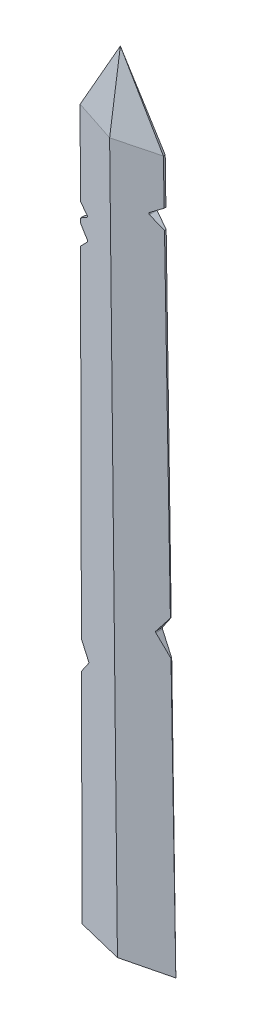
ISO-10303-21;
HEADER;
FILE_DESCRIPTION(('STEP AP214'),'2;1');
FILE_NAME('part.step','',(''),(''),'','','');
FILE_SCHEMA(('AUTOMOTIVE_DESIGN { 1 0 10303 214 1 1 1 1 }'));
ENDSEC;
DATA;
#1=APPLICATION_CONTEXT('core data for automotive mechanical design processes');
#2=APPLICATION_PROTOCOL_DEFINITION('international standard','automotive_design',2000,#1);
#3=PRODUCT_CONTEXT('',#1,'mechanical');
#4=PRODUCT('Part','Part','',(#3));
#5=PRODUCT_RELATED_PRODUCT_CATEGORY('part','',(#4));
#6=PRODUCT_DEFINITION_FORMATION('','',#4);
#7=PRODUCT_DEFINITION_CONTEXT('part definition',#1,'design');
#8=PRODUCT_DEFINITION('design','',#6,#7);
#9=PRODUCT_DEFINITION_SHAPE('','',#8);
#10=(LENGTH_UNIT() NAMED_UNIT(*) SI_UNIT(.MILLI.,.METRE.));
#11=(NAMED_UNIT(*) PLANE_ANGLE_UNIT() SI_UNIT($,.RADIAN.));
#12=(NAMED_UNIT(*) SI_UNIT($,.STERADIAN.) SOLID_ANGLE_UNIT());
#13=UNCERTAINTY_MEASURE_WITH_UNIT(LENGTH_MEASURE(1.E-05),#10,'distance_accuracy_value','');
#14=(GEOMETRIC_REPRESENTATION_CONTEXT(3) GLOBAL_UNCERTAINTY_ASSIGNED_CONTEXT((#13)) GLOBAL_UNIT_ASSIGNED_CONTEXT((#10,
#11,#12)) REPRESENTATION_CONTEXT('',''));
#15=CARTESIAN_POINT('',(0.,0.,0.));
#16=DIRECTION('',(0.,0.,1.));
#17=DIRECTION('',(1.,0.,0.));
#18=AXIS2_PLACEMENT_3D('',#15,#16,#17);
#19=CARTESIAN_POINT('',(134.681996719391,219.836565958458,-9.525));
#20=DIRECTION('',(0.999866416510167,0.0163446974617832,0.));
#21=DIRECTION('',(-0.0163446974617832,0.999866416510167,0.));
#22=AXIS2_PLACEMENT_3D('',#19,#20,#21);
#23=PLANE('',#22);
#24=DIRECTION('',(0.,0.,1.));
#25=VECTOR('',#24,1.);
#26=CARTESIAN_POINT('',(130.972260191043,446.775056405867,-9.52500000000005));
#27=LINE('',#26,#25);
#28=CARTESIAN_POINT('',(130.972260191043,446.775056405867,-0.295268139187183));
#29=VERTEX_POINT('',#28);
#30=CARTESIAN_POINT('',(130.972260191043,446.775056405867,0.29526813918717));
#31=VERTEX_POINT('',#30);
#32=EDGE_CURVE('E408',#29,#31,#27,.T.);
#33=ORIENTED_EDGE('',*,*,#32,.T.);
#34=DIRECTION('',(-0.0163446836309879,0.999865570428571,0.00130091834944232));
#35=VECTOR('',#34,1.);
#36=CARTESIAN_POINT('',(134.682199250408,219.824176376929,-1.61200009608092E-05));
#37=LINE('',#36,#35);
#38=CARTESIAN_POINT('',(134.681996719391,219.836565958458,0.));
#39=VERTEX_POINT('',#38);
#40=EDGE_CURVE('E353',#39,#31,#37,.T.);
#41=ORIENTED_EDGE('',*,*,#40,.F.);
#42=DIRECTION('',(0.0163446836309879,-0.999865570428571,0.00130091834944232));
#43=VECTOR('',#42,1.);
#44=CARTESIAN_POINT('',(134.681794188375,219.848955539986,-1.61200009590745E-05));
#45=LINE('',#44,#43);
#46=EDGE_CURVE('E315',#29,#39,#45,.T.);
#47=ORIENTED_EDGE('',*,*,#46,.F.);
#48=EDGE_LOOP('',(#33,#41,#47));
#49=FACE_BOUND('',#48,.T.);
#50=ADVANCED_FACE('F33',(#49),#23,.T.);
#51=CARTESIAN_POINT('',(49.2246430956603,942.792954579603,0.));
#52=DIRECTION('',(0.238804060374286,0.00264025652948276,0.971064184178478));
#53=DIRECTION('',(0.971067568818316,0.,-0.238804892724763));
#54=AXIS2_PLACEMENT_3D('',#51,#52,#53);
#55=PLANE('',#54);
#56=DIRECTION('',(0.565422398289262,-0.813371444013876,-0.136837149837325));
#57=VECTOR('',#56,1.);
#58=CARTESIAN_POINT('',(-183.97331902332,770.956796433762,57.8152429862953));
#59=LINE('',#58,#57);
#60=CARTESIAN_POINT('',(57.2177665065291,423.998589411468,-0.555102457980421));
#61=VERTEX_POINT('',#60);
#62=CARTESIAN_POINT('',(65.1458488288728,412.593884210018,-2.47376749839539));
#63=VERTEX_POINT('',#62);
#64=EDGE_CURVE('E238',#61,#63,#59,.T.);
#65=ORIENTED_EDGE('',*,*,#64,.F.);
#66=DIRECTION('',(0.,0.999996303727557,-0.00271892096670104));
#67=VECTOR('',#66,1.);
#68=CARTESIAN_POINT('',(57.2177665065291,807.125541731836,-1.59679821194385));
#69=LINE('',#68,#67);
#70=CARTESIAN_POINT('',(57.2177665065291,705.432335957503,-1.32030140058543));
#71=VERTEX_POINT('',#70);
#72=EDGE_CURVE('E325',#61,#71,#69,.T.);
#73=ORIENTED_EDGE('',*,*,#72,.T.);
#74=DIRECTION('',(-0.696425219158623,-0.696425219158644,0.173158390613042));
#75=VECTOR('',#74,1.);
#76=CARTESIAN_POINT('',(168.303638707019,816.518208157996,-28.9405689051451));
#77=LINE('',#76,#75);
#78=CARTESIAN_POINT('',(64.8636119693734,713.078181420348,-3.22135589832697));
#79=VERTEX_POINT('',#78);
#80=EDGE_CURVE('E250',#79,#71,#77,.T.);
#81=ORIENTED_EDGE('',*,*,#80,.F.);
#82=CARTESIAN_POINT('',(64.1900927602932,713.751700629428,-3.05755533707624));
#83=DIRECTION('',(0.238804060374286,0.00264025652948276,0.971064184178478));
#84=DIRECTION('',(-0.971004838791762,-0.0107355874174045,0.238818655481073));
#85=AXIS2_PLACEMENT_3D('',#82,#83,#84);
#86=ELLIPSE('',#85,0.980882639396106,0.952500000000012);
#87=CARTESIAN_POINT('',(64.8636119693734,714.425219838508,-3.22501840286267));
#88=VERTEX_POINT('',#87);
#89=EDGE_CURVE('E257',#88,#79,#86,.F.);
#90=ORIENTED_EDGE('',*,*,#89,.F.);
#91=DIRECTION('',(0.696877354228562,-0.696877354228535,-0.169481286066742));
#92=VECTOR('',#91,1.);
#93=CARTESIAN_POINT('',(-54.0162263991512,833.305058207028,25.6866800069781));
#94=LINE('',#93,#92);
#95=CARTESIAN_POINT('',(57.2177665065291,722.071065301352,-1.36554095787541));
#96=VERTEX_POINT('',#95);
#97=EDGE_CURVE('E255',#96,#88,#94,.T.);
#98=ORIENTED_EDGE('',*,*,#97,.F.);
#99=CARTESIAN_POINT('',(57.2177665065291,725.582342683302,-1.37508787885712));
#100=VERTEX_POINT('',#99);
#101=EDGE_CURVE('E455',#96,#100,#69,.T.);
#102=ORIENTED_EDGE('',*,*,#101,.T.);
#103=DIRECTION('',(-0.804607640589238,-0.559330162341017,0.199389854809593));
#104=VECTOR('',#103,1.);
#105=CARTESIAN_POINT('',(149.576215529185,789.786140509004,-24.2624391940651));
#106=LINE('',#105,#104);
#107=CARTESIAN_POINT('',(64.4504287366713,730.610192203076,-3.16741422427782));
#108=VERTEX_POINT('',#107);
#109=EDGE_CURVE('E267',#108,#100,#106,.T.);
#110=ORIENTED_EDGE('',*,*,#109,.F.);
#111=CARTESIAN_POINT('',(63.9067498173311,731.392285217151,-3.03583918590961));
#112=DIRECTION('',(0.238804060374286,0.00264025652948276,0.971064184178478));
#113=DIRECTION('',(-0.971004838791762,-0.0107355874174045,0.238818655481073));
#114=AXIS2_PLACEMENT_3D('',#111,#112,#113);
#115=ELLIPSE('',#114,0.980882639396072,0.952499999999979);
#116=CARTESIAN_POINT('',(64.475710809278,732.156182880221,-3.17783503243639));
#117=VERTEX_POINT('',#116);
#118=EDGE_CURVE('E274',#117,#108,#115,.F.);
#119=ORIENTED_EDGE('',*,*,#118,.F.);
#120=DIRECTION('',(0.787076820241769,-0.58622513202071,-0.19196399043937));
#121=VECTOR('',#120,1.);
#122=CARTESIAN_POINT('',(-42.641006156892,811.938117667513,22.9473815954327));
#123=LINE('',#122,#121);
#124=CARTESIAN_POINT('',(57.2177665065291,737.561994927602,-1.40765972691236));
#125=VERTEX_POINT('',#124);
#126=EDGE_CURVE('E272',#125,#117,#123,.T.);
#127=ORIENTED_EDGE('',*,*,#126,.F.);
#128=CARTESIAN_POINT('',(57.2177665065291,807.103985498089,-1.59673960203131));
#129=VERTEX_POINT('',#128);
#130=EDGE_CURVE('E319',#125,#129,#69,.T.);
#131=ORIENTED_EDGE('',*,*,#130,.T.);
#132=DIRECTION('',(-0.964371981253038,0.117875055876131,0.236837819987201));
#133=VECTOR('',#132,1.);
#134=CARTESIAN_POINT('',(33.9948623465476,809.942517909522,4.10651816773024));
#135=LINE('',#134,#133);
#136=CARTESIAN_POINT('',(89.5005842942128,803.158061078325,-9.52500000000005));
#137=VERTEX_POINT('',#136);
#138=EDGE_CURVE('E296',#137,#129,#135,.T.);
#139=ORIENTED_EDGE('',*,*,#138,.F.);
#140=DIRECTION('',(0.0110554869516549,-0.999938886236685,0.));
#141=VECTOR('',#140,1.);
#142=CARTESIAN_POINT('',(87.9567582020914,942.792954579603,-9.525));
#143=LINE('',#142,#141);
#144=CARTESIAN_POINT('',(95.9498816129603,219.836565958458,-9.525));
#145=VERTEX_POINT('',#144);
#146=EDGE_CURVE('E313',#137,#145,#143,.T.);
#147=ORIENTED_EDGE('',*,*,#146,.T.);
#148=DIRECTION('',(-0.971067568818316,0.,0.238804892724763));
#149=VECTOR('',#148,1.);
#150=CARTESIAN_POINT('',(57.2177665065291,219.836565958458,0.));
#151=LINE('',#150,#149);
#152=CARTESIAN_POINT('',(57.2177665065291,219.836565958458,0.));
#153=VERTEX_POINT('',#152);
#154=EDGE_CURVE('E307',#145,#153,#151,.T.);
#155=ORIENTED_EDGE('',*,*,#154,.T.);
#156=CARTESIAN_POINT('',(57.2177665065291,400.861282195755,-0.492193715750765));
#157=VERTEX_POINT('',#156);
#158=EDGE_CURVE('E321',#153,#157,#69,.T.);
#159=ORIENTED_EDGE('',*,*,#158,.T.);
#160=DIRECTION('',(-0.590805433978455,-0.793226419267353,0.147447573590831));
#161=VECTOR('',#160,1.);
#162=CARTESIAN_POINT('',(308.357084243052,738.045624600859,-63.1691443730078));
#163=LINE('',#162,#161);
#164=CARTESIAN_POINT('',(65.1276534778671,411.481244298731,-2.46626770733161));
#165=VERTEX_POINT('',#164);
#166=EDGE_CURVE('E56',#165,#157,#163,.T.);
#167=ORIENTED_EDGE('',*,*,#166,.F.);
#168=CARTESIAN_POINT('',(64.3637558147976,412.050205290678,-2.27995699417265));
#169=DIRECTION('',(0.238804060374286,0.00264025652948276,0.971064184178478));
#170=DIRECTION('',(-0.971004838791762,-0.0107355874174045,0.238818655481073));
#171=AXIS2_PLACEMENT_3D('',#168,#169,#170);
#172=ELLIPSE('',#171,0.980882639396234,0.952500000000136);
#173=EDGE_CURVE('E240',#63,#165,#172,.F.);
#174=ORIENTED_EDGE('',*,*,#173,.F.);
#175=EDGE_LOOP('',(#65,#73,#81,#90,#98,#102,#110,#119,#127,#131,#139,#147,#155,#159,#167,#174));
#176=FACE_BOUND('',#175,.T.);
#177=ADVANCED_FACE('F431',(#176),#55,.F.);
#178=CARTESIAN_POINT('',(88.8309804853994,863.721914098348,9.525));
#179=DIRECTION('',(0.238804060374286,0.00264025652948278,-0.971064184178478));
#180=DIRECTION('',(-0.971067568818316,0.,-0.238804892724763));
#181=AXIS2_PLACEMENT_3D('',#178,#179,#180);
#182=PLANE('',#181);
#183=DIRECTION('',(-0.565422398289262,0.813371444013876,-0.136837149837325));
#184=VECTOR('',#183,1.);
#185=CARTESIAN_POINT('',(-134.209470051229,699.370503035085,-45.7719576851134));
#186=LINE('',#185,#184);
#187=CARTESIAN_POINT('',(65.1458488288728,412.593884210018,2.47376749839539));
#188=VERTEX_POINT('',#187);
#189=CARTESIAN_POINT('',(57.2177665065291,423.998589411468,0.555102457980419));
#190=VERTEX_POINT('',#189);
#191=EDGE_CURVE('E236',#188,#190,#186,.T.);
#192=ORIENTED_EDGE('',*,*,#191,.F.);
#193=CARTESIAN_POINT('',(64.3637558147976,412.050205290678,2.27995699417265));
#194=DIRECTION('',(0.238804060374286,0.00264025652948278,-0.971064184178478));
#195=DIRECTION('',(0.971004838791762,0.0107355874174046,0.238818655481073));
#196=AXIS2_PLACEMENT_3D('',#193,#194,#195);
#197=ELLIPSE('',#196,0.980882639396235,0.952500000000136);
#198=CARTESIAN_POINT('',(65.1276534778671,411.481244298731,2.46626770733162));
#199=VERTEX_POINT('',#198);
#200=EDGE_CURVE('E393',#199,#188,#197,.F.);
#201=ORIENTED_EDGE('',*,*,#200,.F.);
#202=DIRECTION('',(0.590805433978455,0.793226419267353,0.147447573590831));
#203=VECTOR('',#202,1.);
#204=CARTESIAN_POINT('',(285.955419589327,707.968730894513,57.5783510125873));
#205=LINE('',#204,#203);
#206=CARTESIAN_POINT('',(57.2177665065291,400.861282195755,0.492193715750763));
#207=VERTEX_POINT('',#206);
#208=EDGE_CURVE('E233',#207,#199,#205,.T.);
#209=ORIENTED_EDGE('',*,*,#208,.F.);
#210=DIRECTION('',(0.,-0.999996303727557,-0.00271892096670106));
#211=VECTOR('',#210,1.);
#212=CARTESIAN_POINT('',(57.2177665065291,807.073746478871,1.59665738422406));
#213=LINE('',#212,#211);
#214=EDGE_CURVE('E335',#207,#153,#213,.T.);
#215=ORIENTED_EDGE('',*,*,#214,.T.);
#216=DIRECTION('',(0.971067568818316,0.,0.238804892724763));
#217=VECTOR('',#216,1.);
#218=CARTESIAN_POINT('',(95.9498816129603,219.836565958458,9.525));
#219=LINE('',#218,#217);
#220=CARTESIAN_POINT('',(95.9498816129603,219.836565958458,9.525));
#221=VERTEX_POINT('',#220);
#222=EDGE_CURVE('E333',#153,#221,#219,.T.);
#223=ORIENTED_EDGE('',*,*,#222,.T.);
#224=DIRECTION('',(0.0110554869516549,-0.999938886236685,0.));
#225=VECTOR('',#224,1.);
#226=CARTESIAN_POINT('',(88.751463048907,870.914051109623,9.525));
#227=LINE('',#226,#225);
#228=CARTESIAN_POINT('',(89.500584294213,803.158061078325,9.52500000000001));
#229=VERTEX_POINT('',#228);
#230=EDGE_CURVE('E349',#229,#221,#227,.T.);
#231=ORIENTED_EDGE('',*,*,#230,.F.);
#232=DIRECTION('',(0.964371981253038,-0.117875055876131,0.236837819987201));
#233=VECTOR('',#232,1.);
#234=CARTESIAN_POINT('',(57.2177665065292,807.103985498089,1.59673960203132));
#235=LINE('',#234,#233);
#236=CARTESIAN_POINT('',(57.2177665065291,807.103985498089,1.59673960203132));
#237=VERTEX_POINT('',#236);
#238=EDGE_CURVE('E328',#237,#229,#235,.T.);
#239=ORIENTED_EDGE('',*,*,#238,.F.);
#240=CARTESIAN_POINT('',(57.2177665065291,737.561994927602,1.40765972691236));
#241=VERTEX_POINT('',#240);
#242=EDGE_CURVE('E336',#237,#241,#213,.T.);
#243=ORIENTED_EDGE('',*,*,#242,.T.);
#244=DIRECTION('',(-0.787076820241769,0.58622513202071,-0.19196399043937));
#245=VECTOR('',#244,1.);
#246=CARTESIAN_POINT('',(19.8175679838206,765.418152995935,-7.71405643471774));
#247=LINE('',#246,#245);
#248=CARTESIAN_POINT('',(64.475710809278,732.156182880221,3.1778350324364));
#249=VERTEX_POINT('',#248);
#250=EDGE_CURVE('E270',#249,#241,#247,.T.);
#251=ORIENTED_EDGE('',*,*,#250,.F.);
#252=CARTESIAN_POINT('',(63.9067498173311,731.392285217151,3.03583918590962));
#253=DIRECTION('',(0.238804060374286,0.00264025652948278,-0.971064184178478));
#254=DIRECTION('',(0.971004838791762,0.0107355874174046,0.238818655481073));
#255=AXIS2_PLACEMENT_3D('',#252,#253,#254);
#256=ELLIPSE('',#255,0.980882639396072,0.952499999999979);
#257=CARTESIAN_POINT('',(64.4504287366713,730.610192203076,3.16741422427781));
#258=VERTEX_POINT('',#257);
#259=EDGE_CURVE('E378',#258,#249,#256,.F.);
#260=ORIENTED_EDGE('',*,*,#259,.F.);
#261=DIRECTION('',(0.804607640589238,0.559330162341017,0.199389854809593));
#262=VECTOR('',#261,1.);
#263=CARTESIAN_POINT('',(141.159965006135,783.935509053512,22.1768077817121));
#264=LINE('',#263,#262);
#265=CARTESIAN_POINT('',(57.2177665065291,725.582342683302,1.37508787885712));
#266=VERTEX_POINT('',#265);
#267=EDGE_CURVE('E265',#266,#258,#264,.T.);
#268=ORIENTED_EDGE('',*,*,#267,.F.);
#269=CARTESIAN_POINT('',(57.2177665065291,722.071065301352,1.36554095787542));
#270=VERTEX_POINT('',#269);
#271=EDGE_CURVE('E340',#266,#270,#213,.T.);
#272=ORIENTED_EDGE('',*,*,#271,.T.);
#273=DIRECTION('',(-0.696877354228562,0.696877354228535,-0.169481286066742));
#274=VECTOR('',#273,1.);
#275=CARTESIAN_POINT('',(4.74299915270349,774.545832655176,-11.3963761904074));
#276=LINE('',#275,#274);
#277=CARTESIAN_POINT('',(64.8636119693734,714.425219838508,3.22501840286268));
#278=VERTEX_POINT('',#277);
#279=EDGE_CURVE('E253',#278,#270,#276,.T.);
#280=ORIENTED_EDGE('',*,*,#279,.F.);
#281=CARTESIAN_POINT('',(64.1900927602932,713.751700629428,3.05755533707625));
#282=DIRECTION('',(0.238804060374286,0.00264025652948278,-0.971064184178478));
#283=DIRECTION('',(0.971004838791762,0.0107355874174046,0.238818655481073));
#284=AXIS2_PLACEMENT_3D('',#281,#282,#283);
#285=ELLIPSE('',#284,0.980882639396106,0.952500000000012);
#286=CARTESIAN_POINT('',(64.8636119693734,713.078181420348,3.22135589832697));
#287=VERTEX_POINT('',#286);
#288=EDGE_CURVE('E386',#287,#278,#285,.F.);
#289=ORIENTED_EDGE('',*,*,#288,.F.);
#290=DIRECTION('',(0.696425219158623,0.696425219158644,0.173158390613042));
#291=VECTOR('',#290,1.);
#292=CARTESIAN_POINT('',(150.311576163779,798.526145614756,24.4670425191242));
#293=LINE('',#292,#291);
#294=CARTESIAN_POINT('',(57.2177665065291,705.432335957503,1.32030140058543));
#295=VERTEX_POINT('',#294);
#296=EDGE_CURVE('E248',#295,#287,#293,.T.);
#297=ORIENTED_EDGE('',*,*,#296,.F.);
#298=EDGE_CURVE('E789',#295,#190,#213,.T.);
#299=ORIENTED_EDGE('',*,*,#298,.T.);
#300=EDGE_LOOP('',(#192,#201,#209,#215,#223,#231,#239,#243,#251,#260,#268,#272,#280,#289,#297,#299));
#301=FACE_BOUND('',#300,.T.);
#302=ADVANCED_FACE('F442',(#301),#182,.F.);
#303=CARTESIAN_POINT('',(57.2177665065291,807.103985498089,-9.525));
#304=DIRECTION('',(-1.,0.,0.));
#305=DIRECTION('',(0.,0.,1.));
#306=AXIS2_PLACEMENT_3D('',#303,#304,#305);
#307=PLANE('',#306);
#308=ORIENTED_EDGE('',*,*,#72,.F.);
#309=DIRECTION('',(0.,0.,1.));
#310=VECTOR('',#309,1.);
#311=CARTESIAN_POINT('',(57.2177665065291,423.998589411468,-9.525));
#312=LINE('',#311,#310);
#313=EDGE_CURVE('E390',#61,#190,#312,.T.);
#314=ORIENTED_EDGE('',*,*,#313,.T.);
#315=ORIENTED_EDGE('',*,*,#298,.F.);
#316=DIRECTION('',(0.,0.,-1.));
#317=VECTOR('',#316,1.);
#318=CARTESIAN_POINT('',(57.2177665065291,705.432335957503,-9.525));
#319=LINE('',#318,#317);
#320=EDGE_CURVE('E380',#295,#71,#319,.T.);
#321=ORIENTED_EDGE('',*,*,#320,.T.);
#322=EDGE_LOOP('',(#308,#314,#315,#321));
#323=FACE_BOUND('',#322,.T.);
#324=ADVANCED_FACE('F453',(#323),#307,.T.);
#325=ORIENTED_EDGE('',*,*,#214,.F.);
#326=DIRECTION('',(0.,0.,-1.));
#327=VECTOR('',#326,1.);
#328=CARTESIAN_POINT('',(57.2177665065291,400.861282195755,-9.525));
#329=LINE('',#328,#327);
#330=EDGE_CURVE('E388',#207,#157,#329,.T.);
#331=ORIENTED_EDGE('',*,*,#330,.T.);
#332=ORIENTED_EDGE('',*,*,#158,.F.);
#333=EDGE_LOOP('',(#325,#331,#332));
#334=FACE_BOUND('',#333,.T.);
#335=ADVANCED_FACE('F436',(#334),#307,.T.);
#336=ORIENTED_EDGE('',*,*,#101,.F.);
#337=DIRECTION('',(0.,0.,1.));
#338=VECTOR('',#337,1.);
#339=CARTESIAN_POINT('',(57.2177665065291,722.071065301352,-9.525));
#340=LINE('',#339,#338);
#341=EDGE_CURVE('E383',#96,#270,#340,.T.);
#342=ORIENTED_EDGE('',*,*,#341,.T.);
#343=ORIENTED_EDGE('',*,*,#271,.F.);
#344=DIRECTION('',(0.,0.,-1.));
#345=VECTOR('',#344,1.);
#346=CARTESIAN_POINT('',(57.2177665065291,725.582342683302,-9.525));
#347=LINE('',#346,#345);
#348=EDGE_CURVE('E372',#266,#100,#347,.T.);
#349=ORIENTED_EDGE('',*,*,#348,.T.);
#350=EDGE_LOOP('',(#336,#342,#343,#349));
#351=FACE_BOUND('',#350,.T.);
#352=ADVANCED_FACE('F737',(#351),#307,.T.);
#353=ORIENTED_EDGE('',*,*,#130,.F.);
#354=DIRECTION('',(0.,0.,1.));
#355=VECTOR('',#354,1.);
#356=CARTESIAN_POINT('',(57.2177665065291,737.561994927602,-9.525));
#357=LINE('',#356,#355);
#358=EDGE_CURVE('E375',#125,#241,#357,.T.);
#359=ORIENTED_EDGE('',*,*,#358,.T.);
#360=ORIENTED_EDGE('',*,*,#242,.F.);
#361=DIRECTION('',(0.,0.,1.));
#362=VECTOR('',#361,1.);
#363=CARTESIAN_POINT('',(57.2177665065291,807.103985498089,-9.525));
#364=LINE('',#363,#362);
#365=EDGE_CURVE('E357',#129,#237,#364,.T.);
#366=ORIENTED_EDGE('',*,*,#365,.F.);
#367=EDGE_LOOP('',(#353,#359,#360,#366));
#368=FACE_BOUND('',#367,.T.);
#369=ADVANCED_FACE('F35',(#368),#307,.T.);
#370=DIRECTION('',(0.,0.,1.));
#371=VECTOR('',#370,1.);
#372=CARTESIAN_POINT('',(125.746024678191,766.483474765532,-9.52500000000005));
#373=LINE('',#372,#371);
#374=CARTESIAN_POINT('',(125.746024678191,766.483474765532,-0.711238605834015));
#375=VERTEX_POINT('',#374);
#376=CARTESIAN_POINT('',(125.746024678191,766.483474765532,0.711238605834009));
#377=VERTEX_POINT('',#376);
#378=EDGE_CURVE('E281',#375,#377,#373,.T.);
#379=ORIENTED_EDGE('',*,*,#378,.F.);
#380=CARTESIAN_POINT('',(125.140068316515,803.552097009916,-0.759468340202823));
#381=VERTEX_POINT('',#380);
#382=EDGE_CURVE('E316',#381,#375,#45,.T.);
#383=ORIENTED_EDGE('',*,*,#382,.F.);
#384=DIRECTION('',(0.,0.,1.));
#385=VECTOR('',#384,1.);
#386=CARTESIAN_POINT('',(125.140068316515,803.552097009916,-9.525));
#387=LINE('',#386,#385);
#388=CARTESIAN_POINT('',(125.140068316515,803.552097009916,0.759468340202815));
#389=VERTEX_POINT('',#388);
#390=EDGE_CURVE('E355',#381,#389,#387,.T.);
#391=ORIENTED_EDGE('',*,*,#390,.T.);
#392=EDGE_CURVE('E352',#377,#389,#37,.T.);
#393=ORIENTED_EDGE('',*,*,#392,.F.);
#394=EDGE_LOOP('',(#379,#383,#391,#393));
#395=FACE_BOUND('',#394,.T.);
#396=ADVANCED_FACE('F492',(#395),#23,.T.);
#397=CARTESIAN_POINT('',(88.8309804853994,863.721914098348,-9.525));
#398=DIRECTION('',(-0.873115591987121,0.487513243952386,0.));
#399=DIRECTION('',(-0.487513243952386,-0.873115591987121,0.));
#400=AXIS2_PLACEMENT_3D('',#397,#398,#399);
#401=PLANE('',#400);
#402=DIRECTION('',(0.487365515987827,0.872851017453344,-0.0246161564136531));
#403=VECTOR('',#402,1.);
#404=CARTESIAN_POINT('',(88.9452525368794,863.926570507406,-0.00577172286638297));
#405=LINE('',#404,#403);
#406=CARTESIAN_POINT('',(88.830980485398,863.721914098348,-3.35235311732518E-13));
#407=VERTEX_POINT('',#406);
#408=EDGE_CURVE('E330',#237,#407,#405,.T.);
#409=ORIENTED_EDGE('',*,*,#408,.T.);
#410=DIRECTION('',(-0.487365515987827,-0.872851017453344,-0.0246161564136429));
#411=VECTOR('',#410,1.);
#412=CARTESIAN_POINT('',(88.7167084339195,863.51725768929,-0.00577172286722952));
#413=LINE('',#412,#411);
#414=EDGE_CURVE('E299',#407,#129,#413,.T.);
#415=ORIENTED_EDGE('',*,*,#414,.T.);
#416=ORIENTED_EDGE('',*,*,#365,.T.);
#417=EDGE_LOOP('',(#409,#415,#416));
#418=FACE_BOUND('',#417,.T.);
#419=ADVANCED_FACE('F468',(#418),#401,.T.);
#420=CARTESIAN_POINT('',(253.060511177469,865.53766249921,40.3922556750294));
#421=DIRECTION('',(-0.234398315242398,-0.153562533675178,0.959935403067719));
#422=DIRECTION('',(0.971457931993895,0.,0.237211901822283));
#423=AXIS2_PLACEMENT_3D('',#420,#421,#422);
#424=PLANE('',#423);
#425=DIRECTION('',(0.0109212623522735,-0.987798634339821,-0.155353094674737));
#426=VECTOR('',#425,1.);
#427=CARTESIAN_POINT('',(88.7624488878927,869.920411693328,0.974850288548136));
#428=LINE('',#427,#426);
#429=EDGE_CURVE('E359',#407,#137,#428,.T.);
#430=ORIENTED_EDGE('',*,*,#429,.F.);
#431=DIRECTION('',(0.516631832159413,-0.85613945984216,-0.0108062621096695));
#432=VECTOR('',#431,1.);
#433=CARTESIAN_POINT('',(125.189005043767,803.471001226367,-0.760491937798964));
#434=LINE('',#433,#432);
#435=EDGE_CURVE('E305',#407,#381,#434,.T.);
#436=ORIENTED_EDGE('',*,*,#435,.T.);
#437=DIRECTION('',(-0.971004838791762,-0.0107355874174104,-0.238818655481073));
#438=VECTOR('',#437,1.);
#439=CARTESIAN_POINT('',(253.730114986282,804.973809479187,30.8672556750294));
#440=LINE('',#439,#438);
#441=EDGE_CURVE('E302',#381,#137,#440,.T.);
#442=ORIENTED_EDGE('',*,*,#441,.T.);
#443=EDGE_LOOP('',(#430,#436,#442));
#444=FACE_BOUND('',#443,.T.);
#445=ADVANCED_FACE('F488',(#444),#424,.F.);
#446=CARTESIAN_POINT('',(125.140068316515,803.552097009916,-9.525));
#447=DIRECTION('',(0.856189452192074,0.516661999720355,0.));
#448=DIRECTION('',(-0.516661999720355,0.856189452192074,0.));
#449=AXIS2_PLACEMENT_3D('',#446,#447,#448);
#450=PLANE('',#449);
#451=ORIENTED_EDGE('',*,*,#435,.F.);
#452=DIRECTION('',(-0.516631832159413,0.85613945984216,-0.010806262109669));
#453=VECTOR('',#452,1.);
#454=CARTESIAN_POINT('',(125.082651579959,803.647245490442,0.758267368318995));
#455=LINE('',#454,#453);
#456=EDGE_CURVE('E343',#389,#407,#455,.T.);
#457=ORIENTED_EDGE('',*,*,#456,.F.);
#458=ORIENTED_EDGE('',*,*,#390,.F.);
#459=EDGE_LOOP('',(#451,#457,#458));
#460=FACE_BOUND('',#459,.T.);
#461=ADVANCED_FACE('F485',(#460),#450,.T.);
#462=DIRECTION('',(0.,0.,1.));
#463=VECTOR('',#462,1.);
#464=CARTESIAN_POINT('',(130.504368951505,475.397717552514,-9.52500000000005));
#465=LINE('',#464,#463);
#466=CARTESIAN_POINT('',(130.504368951505,475.397717552514,-0.332508890541006));
#467=VERTEX_POINT('',#466);
#468=CARTESIAN_POINT('',(130.504368951505,475.397717552514,0.332508890540961));
#469=VERTEX_POINT('',#468);
#470=EDGE_CURVE('E205',#467,#469,#465,.T.);
#471=ORIENTED_EDGE('',*,*,#470,.F.);
#472=CARTESIAN_POINT('',(126.004357543198,750.680284978387,-0.690677182196826));
#473=VERTEX_POINT('',#472);
#474=EDGE_CURVE('E320',#473,#467,#45,.T.);
#475=ORIENTED_EDGE('',*,*,#474,.F.);
#476=DIRECTION('',(0.,0.,1.));
#477=VECTOR('',#476,1.);
#478=CARTESIAN_POINT('',(126.004357543198,750.680284978387,-9.52500000000005));
#479=LINE('',#478,#477);
#480=CARTESIAN_POINT('',(126.004357543198,750.680284978387,0.690677182196816));
#481=VERTEX_POINT('',#480);
#482=EDGE_CURVE('E283',#473,#481,#479,.T.);
#483=ORIENTED_EDGE('',*,*,#482,.T.);
#484=EDGE_CURVE('E356',#469,#481,#37,.T.);
#485=ORIENTED_EDGE('',*,*,#484,.F.);
#486=EDGE_LOOP('',(#471,#475,#483,#485));
#487=FACE_BOUND('',#486,.T.);
#488=ADVANCED_FACE('F402',(#487),#23,.T.);
#489=CARTESIAN_POINT('',(57.2177665065291,219.836565958458,-9.525));
#490=DIRECTION('',(0.,-1.,0.));
#491=DIRECTION('',(0.,0.,-1.));
#492=AXIS2_PLACEMENT_3D('',#489,#490,#491);
#493=PLANE('',#492);
#494=CARTESIAN_POINT('',(95.9498816129603,219.836565958458,0.));
#495=DIRECTION('',(0.,-1.,0.));
#496=DIRECTION('',(0.,0.,-1.));
#497=AXIS2_PLACEMENT_3D('',#494,#495,#496);
#498=CIRCLE('',#497,3.175);
#499=CARTESIAN_POINT('',(95.9498816129603,219.836565958458,-3.175));
#500=VERTEX_POINT('',#499);
#501=EDGE_CURVE('E405',#500,#500,#498,.T.);
#502=ORIENTED_EDGE('',*,*,#501,.F.);
#503=EDGE_LOOP('',(#502));
#504=FACE_BOUND('',#503,.T.);
#505=ORIENTED_EDGE('',*,*,#154,.F.);
#506=DIRECTION('',(-0.971067568818316,0.,-0.238804892724763));
#507=VECTOR('',#506,1.);
#508=CARTESIAN_POINT('',(95.9498816129603,219.836565958458,-9.525));
#509=LINE('',#508,#507);
#510=EDGE_CURVE('E310',#39,#145,#509,.T.);
#511=ORIENTED_EDGE('',*,*,#510,.F.);
#512=DIRECTION('',(0.971067568818316,0.,-0.238804892724763));
#513=VECTOR('',#512,1.);
#514=CARTESIAN_POINT('',(95.9498816129603,219.836565958458,9.525));
#515=LINE('',#514,#513);
#516=EDGE_CURVE('E346',#221,#39,#515,.T.);
#517=ORIENTED_EDGE('',*,*,#516,.F.);
#518=ORIENTED_EDGE('',*,*,#222,.F.);
#519=EDGE_LOOP('',(#505,#511,#517,#518));
#520=FACE_BOUND('',#519,.T.);
#521=ADVANCED_FACE('F421',(#504,#520),#493,.T.);
#522=CARTESIAN_POINT('',(88.751463048907,870.914051109623,9.525));
#523=DIRECTION('',(-0.238804060374287,-0.00264025652948276,-0.971064184178478));
#524=DIRECTION('',(-0.971067568818316,0.,0.238804892724763));
#525=AXIS2_PLACEMENT_3D('',#522,#523,#524);
#526=PLANE('',#525);
#527=ORIENTED_EDGE('',*,*,#40,.T.);
#528=DIRECTION('',(-0.56542239828926,0.813371444013877,0.136837149837325));
#529=VECTOR('',#528,1.);
#530=CARTESIAN_POINT('',(-78.3008042194719,747.818550805447,50.9411742056955));
#531=LINE('',#530,#529);
#532=CARTESIAN_POINT('',(120.845958336896,461.341944428959,2.74592147076072));
#533=VERTEX_POINT('',#532);
#534=EDGE_CURVE('E222',#31,#533,#531,.T.);
#535=ORIENTED_EDGE('',*,*,#534,.T.);
#536=CARTESIAN_POINT('',(121.628051350971,461.885623348299,2.55211096653797));
#537=DIRECTION('',(-0.238804060374287,-0.00264025652948276,-0.971064184178478));
#538=DIRECTION('',(-0.971004838791762,-0.0107355874174045,0.238818655481073));
#539=AXIS2_PLACEMENT_3D('',#536,#537,#538);
#540=ELLIPSE('',#539,0.980882639396235,0.952500000000137);
#541=CARTESIAN_POINT('',(120.864153687902,462.454584340246,2.73842167969695));
#542=VERTEX_POINT('',#541);
#543=EDGE_CURVE('E209',#533,#542,#540,.T.);
#544=ORIENTED_EDGE('',*,*,#543,.T.);
#545=DIRECTION('',(0.590805433978455,0.793226419267352,-0.147447573590831));
#546=VECTOR('',#545,1.);
#547=CARTESIAN_POINT('',(300.485443954866,703.617486216741,-42.0897432150831));
#548=LINE('',#547,#546);
#549=EDGE_CURVE('E202',#542,#469,#548,.T.);
#550=ORIENTED_EDGE('',*,*,#549,.T.);
#551=ORIENTED_EDGE('',*,*,#484,.T.);
#552=DIRECTION('',(-0.787076820241769,0.586225132020711,0.19196399043937));
#553=VECTOR('',#552,1.);
#554=CARTESIAN_POINT('',(46.1154172249093,810.182614840798,20.1751790517357));
#555=LINE('',#554,#553);
#556=CARTESIAN_POINT('',(115.966414800608,758.156676301515,3.13887981644233));
#557=VERTEX_POINT('',#556);
#558=EDGE_CURVE('E280',#481,#557,#555,.T.);
#559=ORIENTED_EDGE('',*,*,#558,.T.);
#560=CARTESIAN_POINT('',(116.535375792555,758.920573964585,2.99688396991557));
#561=DIRECTION('',(-0.238804060374287,-0.00264025652948276,-0.971064184178478));
#562=DIRECTION('',(-0.971004838791762,-0.0107355874174045,0.238818655481073));
#563=AXIS2_PLACEMENT_3D('',#560,#561,#562);
#564=ELLIPSE('',#563,0.980882639396002,0.952499999999911);
#565=CARTESIAN_POINT('',(115.991696873215,759.70266697866,3.12845900828372));
#566=VERTEX_POINT('',#565);
#567=EDGE_CURVE('E293',#557,#566,#564,.T.);
#568=ORIENTED_EDGE('',*,*,#567,.T.);
#569=DIRECTION('',(0.804607640589238,0.559330162341017,-0.199389854809593));
#570=VECTOR('',#569,1.);
#571=CARTESIAN_POINT('',(147.380065222877,781.522570592524,-4.64989393323915));
#572=LINE('',#571,#570);
#573=EDGE_CURVE('E290',#566,#377,#572,.T.);
#574=ORIENTED_EDGE('',*,*,#573,.T.);
#575=ORIENTED_EDGE('',*,*,#392,.T.);
#576=DIRECTION('',(-0.971004838791762,-0.0107355874174043,0.238818655481073));
#577=VECTOR('',#576,1.);
#578=CARTESIAN_POINT('',(263.411960266397,805.080853535213,-33.2485056750293));
#579=LINE('',#578,#577);
#580=EDGE_CURVE('E339',#389,#229,#579,.T.);
#581=ORIENTED_EDGE('',*,*,#580,.T.);
#582=ORIENTED_EDGE('',*,*,#230,.T.);
#583=ORIENTED_EDGE('',*,*,#516,.T.);
#584=EDGE_LOOP('',(#527,#535,#544,#550,#551,#559,#568,#574,#575,#581,#582,#583));
#585=FACE_BOUND('',#584,.T.);
#586=ADVANCED_FACE('F221',(#585),#526,.F.);
#587=CARTESIAN_POINT('',(263.411960266397,805.080853535213,-33.2485056750293));
#588=DIRECTION('',(-0.234398315242399,-0.153562533675178,-0.959935403067719));
#589=DIRECTION('',(-0.971457931993895,0.,0.237211901822284));
#590=AXIS2_PLACEMENT_3D('',#587,#588,#589);
#591=PLANE('',#590);
#592=ORIENTED_EDGE('',*,*,#456,.T.);
#593=DIRECTION('',(0.0109212623522489,-0.98779863433982,0.155353094674742));
#594=VECTOR('',#593,1.);
#595=CARTESIAN_POINT('',(88.8309804853995,863.721914098348,0.));
#596=LINE('',#595,#594);
#597=EDGE_CURVE('E324',#407,#229,#596,.T.);
#598=ORIENTED_EDGE('',*,*,#597,.T.);
#599=ORIENTED_EDGE('',*,*,#580,.F.);
#600=EDGE_LOOP('',(#592,#598,#599));
#601=FACE_BOUND('',#600,.T.);
#602=ADVANCED_FACE('F480',(#601),#591,.F.);
#603=CARTESIAN_POINT('',(56.5481626977157,867.667838518112,-7.92826039796866));
#604=DIRECTION('',(-0.218586785861508,0.149246460882491,0.964336720736479));
#605=DIRECTION('',(0.975259601687497,0.,0.22106268187178));
#606=AXIS2_PLACEMENT_3D('',#603,#604,#605);
#607=PLANE('',#606);
#608=ORIENTED_EDGE('',*,*,#238,.T.);
#609=ORIENTED_EDGE('',*,*,#597,.F.);
#610=ORIENTED_EDGE('',*,*,#408,.F.);
#611=EDGE_LOOP('',(#608,#609,#610));
#612=FACE_BOUND('',#611,.T.);
#613=ADVANCED_FACE('F477',(#612),#607,.T.);
#614=CARTESIAN_POINT('',(87.9567582020914,942.792954579603,-9.525));
#615=DIRECTION('',(-0.238804060374286,-0.00264025652948276,0.971064184178478));
#616=DIRECTION('',(0.971067568818316,0.,0.238804892724763));
#617=AXIS2_PLACEMENT_3D('',#614,#615,#616);
#618=PLANE('',#617);
#619=CARTESIAN_POINT('',(121.628051350971,461.885623348299,-2.55211096653798));
#620=DIRECTION('',(-0.238804060374286,-0.00264025652948276,0.971064184178478));
#621=DIRECTION('',(0.971004838791762,0.0107355874174045,0.238818655481073));
#622=AXIS2_PLACEMENT_3D('',#619,#620,#621);
#623=ELLIPSE('',#622,0.980882639396235,0.952500000000137);
#624=CARTESIAN_POINT('',(120.864153687902,462.454584340246,-2.73842167969696));
#625=VERTEX_POINT('',#624);
#626=CARTESIAN_POINT('',(120.845958336896,461.341944428959,-2.74592147076072));
#627=VERTEX_POINT('',#626);
#628=EDGE_CURVE('E41',#625,#627,#623,.T.);
#629=ORIENTED_EDGE('',*,*,#628,.T.);
#630=DIRECTION('',(0.56542239828926,-0.813371444013877,0.136837149837325));
#631=VECTOR('',#630,1.);
#632=CARTESIAN_POINT('',(-111.611868377617,795.737183738853,-59.0027421436478));
#633=LINE('',#632,#631);
#634=EDGE_CURVE('E11',#627,#29,#633,.T.);
#635=ORIENTED_EDGE('',*,*,#634,.T.);
#636=ORIENTED_EDGE('',*,*,#46,.T.);
#637=ORIENTED_EDGE('',*,*,#510,.T.);
#638=ORIENTED_EDGE('',*,*,#146,.F.);
#639=ORIENTED_EDGE('',*,*,#441,.F.);
#640=ORIENTED_EDGE('',*,*,#382,.T.);
#641=DIRECTION('',(-0.804607640589239,-0.559330162341017,-0.199389854809593));
#642=VECTOR('',#641,1.);
#643=CARTESIAN_POINT('',(179.214055264345,803.652252091468,12.5386764058117));
#644=LINE('',#643,#642);
#645=CARTESIAN_POINT('',(115.991696873215,759.70266697866,-3.12845900828373));
#646=VERTEX_POINT('',#645);
#647=EDGE_CURVE('E369',#375,#646,#644,.T.);
#648=ORIENTED_EDGE('',*,*,#647,.T.);
#649=CARTESIAN_POINT('',(116.535375792555,758.920573964585,-2.99688396991558));
#650=DIRECTION('',(-0.238804060374286,-0.00264025652948276,0.971064184178478));
#651=DIRECTION('',(0.971004838791762,0.0107355874174045,0.238818655481073));
#652=AXIS2_PLACEMENT_3D('',#649,#650,#651);
#653=ELLIPSE('',#652,0.980882639396002,0.952499999999911);
#654=CARTESIAN_POINT('',(115.966414800608,758.156676301515,-3.13887981644234));
#655=VERTEX_POINT('',#654);
#656=EDGE_CURVE('E366',#646,#655,#653,.T.);
#657=ORIENTED_EDGE('',*,*,#656,.T.);
#658=DIRECTION('',(0.787076820241769,-0.586225132020711,0.19196399043937));
#659=VECTOR('',#658,1.);
#660=CARTESIAN_POINT('',(12.4578767056008,835.251192172758,-28.3840801657039));
#661=LINE('',#660,#659);
#662=EDGE_CURVE('E363',#655,#473,#661,.T.);
#663=ORIENTED_EDGE('',*,*,#662,.T.);
#664=ORIENTED_EDGE('',*,*,#474,.T.);
#665=DIRECTION('',(-0.590805433978455,-0.793226419267353,-0.147447573590831));
#666=VECTOR('',#665,1.);
#667=CARTESIAN_POINT('',(333.893558886282,748.471845803565,50.4274212416879));
#668=LINE('',#667,#666);
#669=EDGE_CURVE('E395',#467,#625,#668,.T.);
#670=ORIENTED_EDGE('',*,*,#669,.T.);
#671=EDGE_LOOP('',(#629,#635,#636,#637,#638,#639,#640,#648,#657,#663,#664,#670));
#672=FACE_BOUND('',#671,.T.);
#673=ADVANCED_FACE('F397',(#672),#618,.F.);
#674=CARTESIAN_POINT('',(-23.9331022358085,16.3410189346765,-105.585382191186));
#675=DIRECTION('',(-0.218586785861509,0.149246460882481,-0.964336720736481));
#676=DIRECTION('',(-0.975259601687497,0.,0.221062681871782));
#677=AXIS2_PLACEMENT_3D('',#674,#675,#676);
#678=PLANE('',#677);
#679=ORIENTED_EDGE('',*,*,#429,.T.);
#680=ORIENTED_EDGE('',*,*,#138,.T.);
#681=ORIENTED_EDGE('',*,*,#414,.F.);
#682=EDGE_LOOP('',(#679,#680,#681));
#683=FACE_BOUND('',#682,.T.);
#684=ADVANCED_FACE('F465',(#683),#678,.T.);
#685=CARTESIAN_POINT('',(116.535375792555,758.920573964585,-9.52500000000005));
#686=DIRECTION('',(0.,0.,1.));
#687=DIRECTION('',(1.,0.,0.));
#688=AXIS2_PLACEMENT_3D('',#685,#686,#687);
#689=CYLINDRICAL_SURFACE('',#688,0.952499999999911);
#690=DIRECTION('',(0.,0.,1.));
#691=VECTOR('',#690,1.);
#692=CARTESIAN_POINT('',(115.966414800608,758.156676301515,-9.52500000000005));
#693=LINE('',#692,#691);
#694=EDGE_CURVE('E276',#655,#557,#693,.T.);
#695=ORIENTED_EDGE('',*,*,#694,.F.);
#696=ORIENTED_EDGE('',*,*,#656,.F.);
#697=DIRECTION('',(0.,0.,1.));
#698=VECTOR('',#697,1.);
#699=CARTESIAN_POINT('',(115.991696873215,759.70266697866,-9.52500000000005));
#700=LINE('',#699,#698);
#701=EDGE_CURVE('E277',#646,#566,#700,.T.);
#702=ORIENTED_EDGE('',*,*,#701,.T.);
#703=ORIENTED_EDGE('',*,*,#567,.F.);
#704=EDGE_LOOP('',(#695,#696,#702,#703));
#705=FACE_BOUND('',#704,.T.);
#706=ADVANCED_FACE('F500',(#705),#689,.F.);
#707=CARTESIAN_POINT('',(125.746024678191,766.483474765532,-9.52500000000005));
#708=DIRECTION('',(-0.570791516367642,0.821095027900381,0.));
#709=DIRECTION('',(-0.821095027900381,-0.570791516367642,0.));
#710=AXIS2_PLACEMENT_3D('',#707,#708,#709);
#711=PLANE('',#710);
#712=ORIENTED_EDGE('',*,*,#701,.F.);
#713=ORIENTED_EDGE('',*,*,#647,.F.);
#714=ORIENTED_EDGE('',*,*,#378,.T.);
#715=ORIENTED_EDGE('',*,*,#573,.F.);
#716=EDGE_LOOP('',(#712,#713,#714,#715));
#717=FACE_BOUND('',#716,.T.);
#718=ADVANCED_FACE('F496',(#717),#711,.F.);
#719=CARTESIAN_POINT('',(115.966414800608,758.156676301515,-9.52500000000005));
#720=DIRECTION('',(-0.597334374747374,-0.80199229718568,0.));
#721=DIRECTION('',(0.80199229718568,-0.597334374747374,0.));
#722=AXIS2_PLACEMENT_3D('',#719,#720,#721);
#723=PLANE('',#722);
#724=ORIENTED_EDGE('',*,*,#482,.F.);
#725=ORIENTED_EDGE('',*,*,#662,.F.);
#726=ORIENTED_EDGE('',*,*,#694,.T.);
#727=ORIENTED_EDGE('',*,*,#558,.F.);
#728=EDGE_LOOP('',(#724,#725,#726,#727));
#729=FACE_BOUND('',#728,.T.);
#730=ADVANCED_FACE('F502',(#729),#723,.F.);
#731=CARTESIAN_POINT('',(63.9067498173311,731.392285217151,-9.52500000000005));
#732=DIRECTION('',(0.,0.,1.));
#733=DIRECTION('',(1.,0.,0.));
#734=AXIS2_PLACEMENT_3D('',#731,#732,#733);
#735=CYLINDRICAL_SURFACE('',#734,0.952499999999979);
#736=ORIENTED_EDGE('',*,*,#118,.T.);
#737=DIRECTION('',(0.,0.,1.));
#738=VECTOR('',#737,1.);
#739=CARTESIAN_POINT('',(64.4504287366713,730.610192203076,-9.52500000000005));
#740=LINE('',#739,#738);
#741=EDGE_CURVE('E262',#108,#258,#740,.T.);
#742=ORIENTED_EDGE('',*,*,#741,.T.);
#743=ORIENTED_EDGE('',*,*,#259,.T.);
#744=DIRECTION('',(0.,0.,1.));
#745=VECTOR('',#744,1.);
#746=CARTESIAN_POINT('',(64.475710809278,732.156182880221,-9.52500000000005));
#747=LINE('',#746,#745);
#748=EDGE_CURVE('E259',#117,#249,#747,.T.);
#749=ORIENTED_EDGE('',*,*,#748,.F.);
#750=EDGE_LOOP('',(#736,#742,#743,#749));
#751=FACE_BOUND('',#750,.T.);
#752=ADVANCED_FACE('F504',(#751),#735,.F.);
#753=CARTESIAN_POINT('',(57.2177665065291,737.561994927602,-9.52500000000005));
#754=DIRECTION('',(-0.597334374747374,-0.80199229718568,0.));
#755=DIRECTION('',(0.80199229718568,-0.597334374747374,0.));
#756=AXIS2_PLACEMENT_3D('',#753,#754,#755);
#757=PLANE('',#756);
#758=ORIENTED_EDGE('',*,*,#126,.T.);
#759=ORIENTED_EDGE('',*,*,#748,.T.);
#760=ORIENTED_EDGE('',*,*,#250,.T.);
#761=ORIENTED_EDGE('',*,*,#358,.F.);
#762=EDGE_LOOP('',(#758,#759,#760,#761));
#763=FACE_BOUND('',#762,.T.);
#764=ADVANCED_FACE('F510',(#763),#757,.T.);
#765=CARTESIAN_POINT('',(64.4504287366713,730.610192203076,-9.52500000000005));
#766=DIRECTION('',(-0.570791516367642,0.821095027900381,0.));
#767=DIRECTION('',(-0.821095027900381,-0.570791516367642,0.));
#768=AXIS2_PLACEMENT_3D('',#765,#766,#767);
#769=PLANE('',#768);
#770=ORIENTED_EDGE('',*,*,#109,.T.);
#771=ORIENTED_EDGE('',*,*,#348,.F.);
#772=ORIENTED_EDGE('',*,*,#267,.T.);
#773=ORIENTED_EDGE('',*,*,#741,.F.);
#774=EDGE_LOOP('',(#770,#771,#772,#773));
#775=FACE_BOUND('',#774,.T.);
#776=ADVANCED_FACE('F574',(#775),#769,.T.);
#777=CARTESIAN_POINT('',(64.1900927602932,713.751700629428,-9.52500000000005));
#778=DIRECTION('',(0.,0.,1.));
#779=DIRECTION('',(1.,0.,0.));
#780=AXIS2_PLACEMENT_3D('',#777,#778,#779);
#781=CYLINDRICAL_SURFACE('',#780,0.952500000000012);
#782=ORIENTED_EDGE('',*,*,#89,.T.);
#783=DIRECTION('',(0.,0.,1.));
#784=VECTOR('',#783,1.);
#785=CARTESIAN_POINT('',(64.8636119693734,713.078181420348,-9.52500000000005));
#786=LINE('',#785,#784);
#787=EDGE_CURVE('E245',#79,#287,#786,.T.);
#788=ORIENTED_EDGE('',*,*,#787,.T.);
#789=ORIENTED_EDGE('',*,*,#288,.T.);
#790=DIRECTION('',(0.,0.,1.));
#791=VECTOR('',#790,1.);
#792=CARTESIAN_POINT('',(64.8636119693734,714.425219838508,-9.52500000000005));
#793=LINE('',#792,#791);
#794=EDGE_CURVE('E242',#88,#278,#793,.T.);
#795=ORIENTED_EDGE('',*,*,#794,.F.);
#796=EDGE_LOOP('',(#782,#788,#789,#795));
#797=FACE_BOUND('',#796,.T.);
#798=ADVANCED_FACE('F584',(#797),#781,.F.);
#799=CARTESIAN_POINT('',(57.2177665065291,722.071065301352,-9.52500000000005));
#800=DIRECTION('',(-0.707106781186534,-0.707106781186561,0.));
#801=DIRECTION('',(0.707106781186561,-0.707106781186534,0.));
#802=AXIS2_PLACEMENT_3D('',#799,#800,#801);
#803=PLANE('',#802);
#804=ORIENTED_EDGE('',*,*,#97,.T.);
#805=ORIENTED_EDGE('',*,*,#794,.T.);
#806=ORIENTED_EDGE('',*,*,#279,.T.);
#807=ORIENTED_EDGE('',*,*,#341,.F.);
#808=EDGE_LOOP('',(#804,#805,#806,#807));
#809=FACE_BOUND('',#808,.T.);
#810=ADVANCED_FACE('F594',(#809),#803,.T.);
#811=CARTESIAN_POINT('',(64.8636119693734,713.078181420348,-9.52500000000005));
#812=DIRECTION('',(-0.707106781186558,0.707106781186537,0.));
#813=DIRECTION('',(-0.707106781186537,-0.707106781186558,0.));
#814=AXIS2_PLACEMENT_3D('',#811,#812,#813);
#815=PLANE('',#814);
#816=ORIENTED_EDGE('',*,*,#80,.T.);
#817=ORIENTED_EDGE('',*,*,#320,.F.);
#818=ORIENTED_EDGE('',*,*,#296,.T.);
#819=ORIENTED_EDGE('',*,*,#787,.F.);
#820=EDGE_LOOP('',(#816,#817,#818,#819));
#821=FACE_BOUND('',#820,.T.);
#822=ADVANCED_FACE('F604',(#821),#815,.T.);
#823=CARTESIAN_POINT('',(64.3637558147976,412.050205290678,-9.52500000000005));
#824=DIRECTION('',(0.,0.,1.));
#825=DIRECTION('',(1.,0.,0.));
#826=AXIS2_PLACEMENT_3D('',#823,#824,#825);
#827=CYLINDRICAL_SURFACE('',#826,0.952500000000136);
#828=ORIENTED_EDGE('',*,*,#173,.T.);
#829=DIRECTION('',(0.,0.,1.));
#830=VECTOR('',#829,1.);
#831=CARTESIAN_POINT('',(65.1276534778671,411.481244298731,-9.52500000000005));
#832=LINE('',#831,#830);
#833=EDGE_CURVE('E230',#165,#199,#832,.T.);
#834=ORIENTED_EDGE('',*,*,#833,.T.);
#835=ORIENTED_EDGE('',*,*,#200,.T.);
#836=DIRECTION('',(0.,0.,1.));
#837=VECTOR('',#836,1.);
#838=CARTESIAN_POINT('',(65.1458488288728,412.593884210018,-9.52500000000005));
#839=LINE('',#838,#837);
#840=EDGE_CURVE('E224',#63,#188,#839,.T.);
#841=ORIENTED_EDGE('',*,*,#840,.F.);
#842=EDGE_LOOP('',(#828,#834,#835,#841));
#843=FACE_BOUND('',#842,.T.);
#844=ADVANCED_FACE('F446',(#843),#827,.F.);
#845=CARTESIAN_POINT('',(57.2177665065291,423.998589411468,-9.52500000000005));
#846=DIRECTION('',(-0.821095027900379,-0.570791516367645,0.));
#847=DIRECTION('',(0.570791516367645,-0.821095027900379,0.));
#848=AXIS2_PLACEMENT_3D('',#845,#846,#847);
#849=PLANE('',#848);
#850=ORIENTED_EDGE('',*,*,#64,.T.);
#851=ORIENTED_EDGE('',*,*,#840,.T.);
#852=ORIENTED_EDGE('',*,*,#191,.T.);
#853=ORIENTED_EDGE('',*,*,#313,.F.);
#854=EDGE_LOOP('',(#850,#851,#852,#853));
#855=FACE_BOUND('',#854,.T.);
#856=ADVANCED_FACE('F449',(#855),#849,.T.);
#857=CARTESIAN_POINT('',(65.1276534778671,411.481244298731,-9.52500000000005));
#858=DIRECTION('',(-0.801992297185679,0.597334374747375,0.));
#859=DIRECTION('',(-0.597334374747375,-0.801992297185679,0.));
#860=AXIS2_PLACEMENT_3D('',#857,#858,#859);
#861=PLANE('',#860);
#862=ORIENTED_EDGE('',*,*,#166,.T.);
#863=ORIENTED_EDGE('',*,*,#330,.F.);
#864=ORIENTED_EDGE('',*,*,#208,.T.);
#865=ORIENTED_EDGE('',*,*,#833,.F.);
#866=EDGE_LOOP('',(#862,#863,#864,#865));
#867=FACE_BOUND('',#866,.T.);
#868=ADVANCED_FACE('F438',(#867),#861,.T.);
#869=CARTESIAN_POINT('',(120.845958336896,461.341944428959,-9.52500000000005));
#870=DIRECTION('',(-0.821095027900381,-0.570791516367643,0.));
#871=DIRECTION('',(0.570791516367643,-0.821095027900381,0.));
#872=AXIS2_PLACEMENT_3D('',#869,#870,#871);
#873=PLANE('',#872);
#874=ORIENTED_EDGE('',*,*,#32,.F.);
#875=ORIENTED_EDGE('',*,*,#634,.F.);
#876=DIRECTION('',(0.,0.,1.));
#877=VECTOR('',#876,1.);
#878=CARTESIAN_POINT('',(120.845958336896,461.341944428959,-9.52500000000005));
#879=LINE('',#878,#877);
#880=EDGE_CURVE('E217',#627,#533,#879,.T.);
#881=ORIENTED_EDGE('',*,*,#880,.T.);
#882=ORIENTED_EDGE('',*,*,#534,.F.);
#883=EDGE_LOOP('',(#874,#875,#881,#882));
#884=FACE_BOUND('',#883,.T.);
#885=ADVANCED_FACE('F639',(#884),#873,.F.);
#886=CARTESIAN_POINT('',(121.628051350971,461.885623348299,-9.52500000000005));
#887=DIRECTION('',(0.,0.,1.));
#888=DIRECTION('',(1.,0.,0.));
#889=AXIS2_PLACEMENT_3D('',#886,#887,#888);
#890=CYLINDRICAL_SURFACE('',#889,0.952500000000137);
#891=ORIENTED_EDGE('',*,*,#880,.F.);
#892=ORIENTED_EDGE('',*,*,#628,.F.);
#893=DIRECTION('',(0.,0.,1.));
#894=VECTOR('',#893,1.);
#895=CARTESIAN_POINT('',(120.864153687902,462.454584340246,-9.52500000000005));
#896=LINE('',#895,#894);
#897=EDGE_CURVE('E48',#625,#542,#896,.T.);
#898=ORIENTED_EDGE('',*,*,#897,.T.);
#899=ORIENTED_EDGE('',*,*,#543,.F.);
#900=EDGE_LOOP('',(#891,#892,#898,#899));
#901=FACE_BOUND('',#900,.T.);
#902=ADVANCED_FACE('F213',(#901),#890,.F.);
#903=CARTESIAN_POINT('',(130.504368951505,475.397717552514,-9.52500000000005));
#904=DIRECTION('',(-0.801992297185679,0.597334374747375,0.));
#905=DIRECTION('',(-0.597334374747375,-0.801992297185679,0.));
#906=AXIS2_PLACEMENT_3D('',#903,#904,#905);
#907=PLANE('',#906);
#908=ORIENTED_EDGE('',*,*,#897,.F.);
#909=ORIENTED_EDGE('',*,*,#669,.F.);
#910=ORIENTED_EDGE('',*,*,#470,.T.);
#911=ORIENTED_EDGE('',*,*,#549,.F.);
#912=EDGE_LOOP('',(#908,#909,#910,#911));
#913=FACE_BOUND('',#912,.T.);
#914=ADVANCED_FACE('F203',(#913),#907,.F.);
#915=CARTESIAN_POINT('',(95.9498816129603,778.636565958458,0.));
#916=DIRECTION('',(0.,-1.,0.));
#917=DIRECTION('',(0.,0.,-1.));
#918=AXIS2_PLACEMENT_3D('',#915,#916,#917);
#919=CYLINDRICAL_SURFACE('',#918,3.175);
#920=CARTESIAN_POINT('',(95.9498816129603,778.636565958458,0.));
#921=DIRECTION('',(0.,-1.,0.));
#922=DIRECTION('',(0.,0.,-1.));
#923=AXIS2_PLACEMENT_3D('',#920,#921,#922);
#924=CIRCLE('',#923,3.175);
#925=CARTESIAN_POINT('',(95.9498816129603,778.636565958458,-3.175));
#926=VERTEX_POINT('',#925);
#927=EDGE_CURVE('E410',#926,#926,#924,.T.);
#928=ORIENTED_EDGE('',*,*,#927,.F.);
#929=EDGE_LOOP('',(#928));
#930=FACE_BOUND('',#929,.T.);
#931=ORIENTED_EDGE('',*,*,#501,.T.);
#932=EDGE_LOOP('',(#931));
#933=FACE_BOUND('',#932,.T.);
#934=ADVANCED_FACE('F419',(#930,#933),#919,.F.);
#935=CARTESIAN_POINT('',(95.9498816129603,778.636565958458,0.));
#936=DIRECTION('',(0.,-1.,0.));
#937=DIRECTION('',(0.,0.,-1.));
#938=AXIS2_PLACEMENT_3D('',#935,#936,#937);
#939=PLANE('',#938);
#940=ORIENTED_EDGE('',*,*,#927,.T.);
#941=EDGE_LOOP('',(#940));
#942=FACE_BOUND('',#941,.T.);
#943=ADVANCED_FACE('F681',(#942),#939,.T.);
#944=CLOSED_SHELL('',(#50,#177,#302,#324,#335,#352,#369,#396,#419,#445,#461,#488,#521,#586,#602,
#613,#673,#684,#706,#718,#730,#752,#764,#776,#798,#810,#822,#844,#856,#868,#885,#902,#914,#934,#943));
#945=MANIFOLD_SOLID_BREP('B2',#944);
#946=ADVANCED_BREP_SHAPE_REPRESENTATION('',(#18,#945),#14);
#947=SHAPE_DEFINITION_REPRESENTATION(#9,#946);
ENDSEC;
END-ISO-10303-21;
